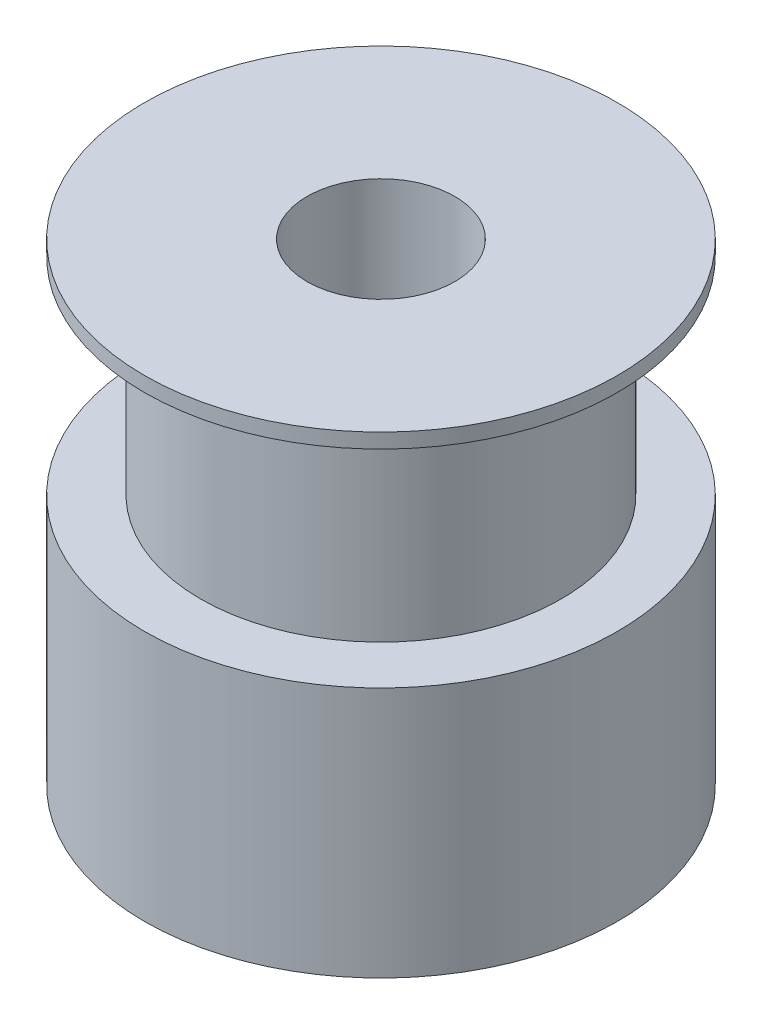
ISO-10303-21;
HEADER;
FILE_DESCRIPTION(('STEP AP214'),'2;1');
FILE_NAME('part.step','',(''),(''),'','','');
FILE_SCHEMA(('AUTOMOTIVE_DESIGN { 1 0 10303 214 1 1 1 1 }'));
ENDSEC;
DATA;
#1=APPLICATION_CONTEXT('core data for automotive mechanical design processes');
#2=APPLICATION_PROTOCOL_DEFINITION('international standard','automotive_design',2000,#1);
#3=PRODUCT_CONTEXT('',#1,'mechanical');
#4=PRODUCT('Part','Part','',(#3));
#5=PRODUCT_RELATED_PRODUCT_CATEGORY('part','',(#4));
#6=PRODUCT_DEFINITION_FORMATION('','',#4);
#7=PRODUCT_DEFINITION_CONTEXT('part definition',#1,'design');
#8=PRODUCT_DEFINITION('design','',#6,#7);
#9=PRODUCT_DEFINITION_SHAPE('','',#8);
#10=(LENGTH_UNIT() NAMED_UNIT(*) SI_UNIT(.MILLI.,.METRE.));
#11=(NAMED_UNIT(*) PLANE_ANGLE_UNIT() SI_UNIT($,.RADIAN.));
#12=(NAMED_UNIT(*) SI_UNIT($,.STERADIAN.) SOLID_ANGLE_UNIT());
#13=UNCERTAINTY_MEASURE_WITH_UNIT(LENGTH_MEASURE(1.E-05),#10,'distance_accuracy_value','');
#14=(GEOMETRIC_REPRESENTATION_CONTEXT(3) GLOBAL_UNCERTAINTY_ASSIGNED_CONTEXT((#13)) GLOBAL_UNIT_ASSIGNED_CONTEXT((#10,
#11,#12)) REPRESENTATION_CONTEXT('',''));
#15=CARTESIAN_POINT('',(0.,0.,0.));
#16=DIRECTION('',(0.,0.,1.));
#17=DIRECTION('',(1.,0.,0.));
#18=AXIS2_PLACEMENT_3D('',#15,#16,#17);
#19=CARTESIAN_POINT('',(0.,16.,0.));
#20=DIRECTION('',(0.,-1.,0.));
#21=DIRECTION('',(0.,0.,-1.));
#22=AXIS2_PLACEMENT_3D('',#19,#20,#21);
#23=CYLINDRICAL_SURFACE('',#22,8.);
#24=CARTESIAN_POINT('',(0.,0.,0.));
#25=DIRECTION('',(0.,1.,0.));
#26=DIRECTION('',(0.,0.,1.));
#27=AXIS2_PLACEMENT_3D('',#24,#25,#26);
#28=CIRCLE('',#27,8.);
#29=CARTESIAN_POINT('',(0.,0.,8.));
#30=VERTEX_POINT('',#29);
#31=EDGE_CURVE('E41',#30,#30,#28,.T.);
#32=ORIENTED_EDGE('',*,*,#31,.T.);
#33=EDGE_LOOP('',(#32));
#34=FACE_BOUND('',#33,.T.);
#35=CARTESIAN_POINT('',(0.,8.5,0.));
#36=DIRECTION('',(0.,1.,0.));
#37=DIRECTION('',(0.,0.,1.));
#38=AXIS2_PLACEMENT_3D('',#35,#36,#37);
#39=CIRCLE('',#38,8.);
#40=CARTESIAN_POINT('',(0.,8.5,8.));
#41=VERTEX_POINT('',#40);
#42=EDGE_CURVE('E37',#41,#41,#39,.T.);
#43=ORIENTED_EDGE('',*,*,#42,.F.);
#44=EDGE_LOOP('',(#43));
#45=FACE_BOUND('',#44,.T.);
#46=ADVANCED_FACE('F33',(#34,#45),#23,.T.);
#47=CARTESIAN_POINT('',(0.,16.,0.));
#48=DIRECTION('',(0.,1.,0.));
#49=DIRECTION('',(0.,0.,1.));
#50=AXIS2_PLACEMENT_3D('',#47,#48,#49);
#51=PLANE('',#50);
#52=CARTESIAN_POINT('',(0.,16.,0.));
#53=DIRECTION('',(0.,1.,0.));
#54=DIRECTION('',(0.,0.,1.));
#55=AXIS2_PLACEMENT_3D('',#52,#53,#54);
#56=CIRCLE('',#55,8.);
#57=CARTESIAN_POINT('',(0.,16.,8.));
#58=VERTEX_POINT('',#57);
#59=EDGE_CURVE('E10',#58,#58,#56,.T.);
#60=ORIENTED_EDGE('',*,*,#59,.T.);
#61=EDGE_LOOP('',(#60));
#62=FACE_BOUND('',#61,.T.);
#63=CARTESIAN_POINT('',(0.,16.,0.));
#64=DIRECTION('',(0.,1.,0.));
#65=DIRECTION('',(0.,0.,1.));
#66=AXIS2_PLACEMENT_3D('',#63,#64,#65);
#67=CIRCLE('',#66,2.5);
#68=CARTESIAN_POINT('',(0.,16.,2.5));
#69=VERTEX_POINT('',#68);
#70=EDGE_CURVE('E46',#69,#69,#67,.T.);
#71=ORIENTED_EDGE('',*,*,#70,.F.);
#72=EDGE_LOOP('',(#71));
#73=FACE_BOUND('',#72,.T.);
#74=ADVANCED_FACE('F86',(#62,#73),#51,.T.);
#75=CARTESIAN_POINT('',(0.,0.,0.));
#76=DIRECTION('',(0.,1.,0.));
#77=DIRECTION('',(0.,0.,1.));
#78=AXIS2_PLACEMENT_3D('',#75,#76,#77);
#79=PLANE('',#78);
#80=ORIENTED_EDGE('',*,*,#31,.F.);
#81=EDGE_LOOP('',(#80));
#82=FACE_BOUND('',#81,.T.);
#83=CARTESIAN_POINT('',(0.,0.,0.));
#84=DIRECTION('',(0.,1.,0.));
#85=DIRECTION('',(0.,0.,1.));
#86=AXIS2_PLACEMENT_3D('',#83,#84,#85);
#87=CIRCLE('',#86,2.5);
#88=CARTESIAN_POINT('',(0.,0.,2.5));
#89=VERTEX_POINT('',#88);
#90=EDGE_CURVE('E49',#89,#89,#87,.T.);
#91=ORIENTED_EDGE('',*,*,#90,.T.);
#92=EDGE_LOOP('',(#91));
#93=FACE_BOUND('',#92,.T.);
#94=ADVANCED_FACE('F70',(#82,#93),#79,.F.);
#95=CARTESIAN_POINT('',(0.,15.5,0.));
#96=DIRECTION('',(0.,1.,0.));
#97=DIRECTION('',(0.,0.,1.));
#98=AXIS2_PLACEMENT_3D('',#95,#96,#97);
#99=CIRCLE('',#98,8.);
#100=CARTESIAN_POINT('',(0.,15.5,8.));
#101=VERTEX_POINT('',#100);
#102=EDGE_CURVE('E51',#101,#101,#99,.T.);
#103=ORIENTED_EDGE('',*,*,#102,.T.);
#104=EDGE_LOOP('',(#103));
#105=FACE_BOUND('',#104,.T.);
#106=ORIENTED_EDGE('',*,*,#59,.F.);
#107=EDGE_LOOP('',(#106));
#108=FACE_BOUND('',#107,.T.);
#109=ADVANCED_FACE('F35',(#105,#108),#23,.T.);
#110=CARTESIAN_POINT('',(0.,16.,0.));
#111=DIRECTION('',(0.,-1.,0.));
#112=DIRECTION('',(0.,0.,-1.));
#113=AXIS2_PLACEMENT_3D('',#110,#111,#112);
#114=CYLINDRICAL_SURFACE('',#113,2.5);
#115=ORIENTED_EDGE('',*,*,#70,.T.);
#116=EDGE_LOOP('',(#115));
#117=FACE_BOUND('',#116,.T.);
#118=ORIENTED_EDGE('',*,*,#90,.F.);
#119=EDGE_LOOP('',(#118));
#120=FACE_BOUND('',#119,.T.);
#121=ADVANCED_FACE('F72',(#117,#120),#114,.F.);
#122=CARTESIAN_POINT('',(0.,8.5,0.));
#123=DIRECTION('',(0.,1.,0.));
#124=DIRECTION('',(0.,0.,1.));
#125=AXIS2_PLACEMENT_3D('',#122,#123,#124);
#126=PLANE('',#125);
#127=CARTESIAN_POINT('',(0.,8.5,0.));
#128=DIRECTION('',(0.,1.,0.));
#129=DIRECTION('',(0.,0.,1.));
#130=AXIS2_PLACEMENT_3D('',#127,#128,#129);
#131=CIRCLE('',#130,6.1);
#132=CARTESIAN_POINT('',(0.,8.5,6.1));
#133=VERTEX_POINT('',#132);
#134=EDGE_CURVE('E53',#133,#133,#131,.T.);
#135=ORIENTED_EDGE('',*,*,#134,.F.);
#136=EDGE_LOOP('',(#135));
#137=FACE_BOUND('',#136,.T.);
#138=ORIENTED_EDGE('',*,*,#42,.T.);
#139=EDGE_LOOP('',(#138));
#140=FACE_BOUND('',#139,.T.);
#141=ADVANCED_FACE('F74',(#137,#140),#126,.T.);
#142=CARTESIAN_POINT('',(0.,15.5,0.));
#143=DIRECTION('',(0.,1.,0.));
#144=DIRECTION('',(0.,0.,1.));
#145=AXIS2_PLACEMENT_3D('',#142,#143,#144);
#146=PLANE('',#145);
#147=CARTESIAN_POINT('',(0.,15.5,0.));
#148=DIRECTION('',(0.,1.,0.));
#149=DIRECTION('',(0.,0.,1.));
#150=AXIS2_PLACEMENT_3D('',#147,#148,#149);
#151=CIRCLE('',#150,6.1);
#152=CARTESIAN_POINT('',(0.,15.5,6.1));
#153=VERTEX_POINT('',#152);
#154=EDGE_CURVE('E58',#153,#153,#151,.T.);
#155=ORIENTED_EDGE('',*,*,#154,.T.);
#156=EDGE_LOOP('',(#155));
#157=FACE_BOUND('',#156,.T.);
#158=ORIENTED_EDGE('',*,*,#102,.F.);
#159=EDGE_LOOP('',(#158));
#160=FACE_BOUND('',#159,.T.);
#161=ADVANCED_FACE('F80',(#157,#160),#146,.F.);
#162=CARTESIAN_POINT('',(0.,8.5,0.));
#163=DIRECTION('',(0.,1.,0.));
#164=DIRECTION('',(0.,0.,1.));
#165=AXIS2_PLACEMENT_3D('',#162,#163,#164);
#166=CYLINDRICAL_SURFACE('',#165,6.1);
#167=ORIENTED_EDGE('',*,*,#134,.T.);
#168=EDGE_LOOP('',(#167));
#169=FACE_BOUND('',#168,.T.);
#170=ORIENTED_EDGE('',*,*,#154,.F.);
#171=EDGE_LOOP('',(#170));
#172=FACE_BOUND('',#171,.T.);
#173=ADVANCED_FACE('F123',(#169,#172),#166,.T.);
#174=CLOSED_SHELL('',(#46,#74,#94,#109,#121,#141,#161,#173));
#175=MANIFOLD_SOLID_BREP('B2',#174);
#176=ADVANCED_BREP_SHAPE_REPRESENTATION('',(#18,#175),#14);
#177=SHAPE_DEFINITION_REPRESENTATION(#9,#176);
ENDSEC;
END-ISO-10303-21;
